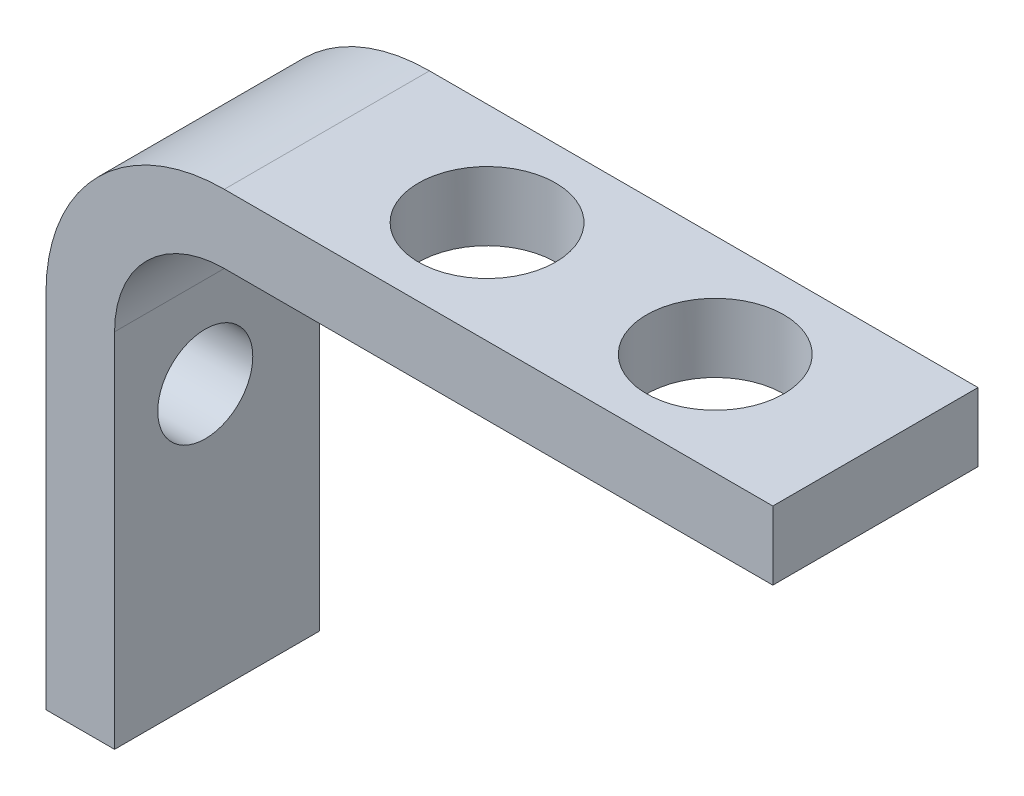
ISO-10303-21;
HEADER;
FILE_DESCRIPTION(('STEP AP214'),'2;1');
FILE_NAME('part.step','',(''),(''),'','','');
FILE_SCHEMA(('AUTOMOTIVE_DESIGN { 1 0 10303 214 1 1 1 1 }'));
ENDSEC;
DATA;
#1=APPLICATION_CONTEXT('core data for automotive mechanical design processes');
#2=APPLICATION_PROTOCOL_DEFINITION('international standard','automotive_design',2000,#1);
#3=PRODUCT_CONTEXT('',#1,'mechanical');
#4=PRODUCT('Part','Part','',(#3));
#5=PRODUCT_RELATED_PRODUCT_CATEGORY('part','',(#4));
#6=PRODUCT_DEFINITION_FORMATION('','',#4);
#7=PRODUCT_DEFINITION_CONTEXT('part definition',#1,'design');
#8=PRODUCT_DEFINITION('design','',#6,#7);
#9=PRODUCT_DEFINITION_SHAPE('','',#8);
#10=(LENGTH_UNIT() NAMED_UNIT(*) SI_UNIT(.MILLI.,.METRE.));
#11=(NAMED_UNIT(*) PLANE_ANGLE_UNIT() SI_UNIT($,.RADIAN.));
#12=(NAMED_UNIT(*) SI_UNIT($,.STERADIAN.) SOLID_ANGLE_UNIT());
#13=UNCERTAINTY_MEASURE_WITH_UNIT(LENGTH_MEASURE(1.E-05),#10,'distance_accuracy_value','');
#14=(GEOMETRIC_REPRESENTATION_CONTEXT(3) GLOBAL_UNCERTAINTY_ASSIGNED_CONTEXT((#13)) GLOBAL_UNIT_ASSIGNED_CONTEXT((#10,
#11,#12)) REPRESENTATION_CONTEXT('',''));
#15=CARTESIAN_POINT('',(0.,0.,0.));
#16=DIRECTION('',(0.,0.,1.));
#17=DIRECTION('',(1.,0.,0.));
#18=AXIS2_PLACEMENT_3D('',#15,#16,#17);
#19=CARTESIAN_POINT('',(-1.5875,0.,4.75));
#20=DIRECTION('',(0.,1.,0.));
#21=DIRECTION('',(0.,0.,1.));
#22=AXIS2_PLACEMENT_3D('',#19,#20,#21);
#23=PLANE('',#22);
#24=DIRECTION('',(1.,0.,0.));
#25=VECTOR('',#24,1.);
#26=CARTESIAN_POINT('',(-1.5875,0.,0.));
#27=LINE('',#26,#25);
#28=CARTESIAN_POINT('',(-1.5875,0.,0.));
#29=VERTEX_POINT('',#28);
#30=CARTESIAN_POINT('',(0.,0.,0.));
#31=VERTEX_POINT('',#30);
#32=EDGE_CURVE('E133',#29,#31,#27,.T.);
#33=ORIENTED_EDGE('',*,*,#32,.T.);
#34=DIRECTION('',(0.,0.,-1.));
#35=VECTOR('',#34,1.);
#36=CARTESIAN_POINT('',(0.,0.,4.75));
#37=LINE('',#36,#35);
#38=CARTESIAN_POINT('',(0.,0.,4.75));
#39=VERTEX_POINT('',#38);
#40=EDGE_CURVE('E11',#39,#31,#37,.T.);
#41=ORIENTED_EDGE('',*,*,#40,.F.);
#42=DIRECTION('',(1.,0.,0.));
#43=VECTOR('',#42,1.);
#44=CARTESIAN_POINT('',(-1.5875,0.,4.75));
#45=LINE('',#44,#43);
#46=CARTESIAN_POINT('',(-1.5875,0.,4.75));
#47=VERTEX_POINT('',#46);
#48=EDGE_CURVE('E148',#47,#39,#45,.T.);
#49=ORIENTED_EDGE('',*,*,#48,.F.);
#50=DIRECTION('',(0.,0.,-1.));
#51=VECTOR('',#50,1.);
#52=CARTESIAN_POINT('',(-1.5875,0.,4.75));
#53=LINE('',#52,#51);
#54=EDGE_CURVE('E129',#47,#29,#53,.T.);
#55=ORIENTED_EDGE('',*,*,#54,.T.);
#56=EDGE_LOOP('',(#33,#41,#49,#55));
#57=FACE_BOUND('',#56,.T.);
#58=ADVANCED_FACE('F35',(#57),#23,.F.);
#59=CARTESIAN_POINT('',(0.,0.,4.75));
#60=DIRECTION('',(-1.,0.,0.));
#61=DIRECTION('',(0.,0.,1.));
#62=AXIS2_PLACEMENT_3D('',#59,#60,#61);
#63=PLANE('',#62);
#64=CARTESIAN_POINT('',(0.,6.27699999999992,2.64999999999981));
#65=DIRECTION('',(-1.,0.,0.));
#66=DIRECTION('',(0.,0.,1.));
#67=AXIS2_PLACEMENT_3D('',#64,#65,#66);
#68=CIRCLE('',#67,1.1);
#69=CARTESIAN_POINT('',(0.,6.27699999999992,3.74999999999981));
#70=VERTEX_POINT('',#69);
#71=EDGE_CURVE('E137',#70,#70,#68,.T.);
#72=ORIENTED_EDGE('',*,*,#71,.T.);
#73=EDGE_LOOP('',(#72));
#74=FACE_BOUND('',#73,.T.);
#75=DIRECTION('',(0.,1.,0.));
#76=VECTOR('',#75,1.);
#77=CARTESIAN_POINT('',(0.,0.,0.));
#78=LINE('',#77,#76);
#79=CARTESIAN_POINT('',(0.,8.3725,0.));
#80=VERTEX_POINT('',#79);
#81=EDGE_CURVE('E136',#31,#80,#78,.T.);
#82=ORIENTED_EDGE('',*,*,#81,.T.);
#83=DIRECTION('',(0.,0.,-1.));
#84=VECTOR('',#83,1.);
#85=CARTESIAN_POINT('',(0.,8.3725,4.75));
#86=LINE('',#85,#84);
#87=CARTESIAN_POINT('',(0.,8.3725,4.75));
#88=VERTEX_POINT('',#87);
#89=EDGE_CURVE('E44',#88,#80,#86,.T.);
#90=ORIENTED_EDGE('',*,*,#89,.F.);
#91=DIRECTION('',(0.,1.,0.));
#92=VECTOR('',#91,1.);
#93=CARTESIAN_POINT('',(0.,0.,4.75));
#94=LINE('',#93,#92);
#95=EDGE_CURVE('E96',#39,#88,#94,.T.);
#96=ORIENTED_EDGE('',*,*,#95,.F.);
#97=ORIENTED_EDGE('',*,*,#40,.T.);
#98=EDGE_LOOP('',(#82,#90,#96,#97));
#99=FACE_BOUND('',#98,.T.);
#100=ADVANCED_FACE('F212',(#74,#99),#63,.F.);
#101=CARTESIAN_POINT('',(2.54,8.3725,4.75));
#102=DIRECTION('',(0.,0.,-1.));
#103=DIRECTION('',(-1.,0.,0.));
#104=AXIS2_PLACEMENT_3D('',#101,#102,#103);
#105=CYLINDRICAL_SURFACE('',#104,2.54);
#106=CARTESIAN_POINT('',(2.54,8.3725,0.));
#107=DIRECTION('',(0.,0.,-1.));
#108=DIRECTION('',(-1.,0.,0.));
#109=AXIS2_PLACEMENT_3D('',#106,#107,#108);
#110=CIRCLE('',#109,2.54);
#111=CARTESIAN_POINT('',(2.54,10.9125,0.));
#112=VERTEX_POINT('',#111);
#113=EDGE_CURVE('E139',#80,#112,#110,.T.);
#114=ORIENTED_EDGE('',*,*,#113,.T.);
#115=DIRECTION('',(0.,0.,-1.));
#116=VECTOR('',#115,1.);
#117=CARTESIAN_POINT('',(2.54,10.9125,4.75));
#118=LINE('',#117,#116);
#119=CARTESIAN_POINT('',(2.54,10.9125,4.75));
#120=VERTEX_POINT('',#119);
#121=EDGE_CURVE('E155',#120,#112,#118,.T.);
#122=ORIENTED_EDGE('',*,*,#121,.F.);
#123=CARTESIAN_POINT('',(2.54,8.3725,4.75));
#124=DIRECTION('',(0.,0.,-1.));
#125=DIRECTION('',(-1.,0.,0.));
#126=AXIS2_PLACEMENT_3D('',#123,#124,#125);
#127=CIRCLE('',#126,2.54);
#128=EDGE_CURVE('E180',#88,#120,#127,.T.);
#129=ORIENTED_EDGE('',*,*,#128,.F.);
#130=ORIENTED_EDGE('',*,*,#89,.T.);
#131=EDGE_LOOP('',(#114,#122,#129,#130));
#132=FACE_BOUND('',#131,.T.);
#133=ADVANCED_FACE('F216',(#132),#105,.F.);
#134=CARTESIAN_POINT('',(2.54,10.9125,4.75));
#135=DIRECTION('',(0.,1.,0.));
#136=DIRECTION('',(-1.,0.,0.));
#137=AXIS2_PLACEMENT_3D('',#134,#135,#136);
#138=PLANE('',#137);
#139=CARTESIAN_POINT('',(6.2484,10.9125,2.375));
#140=DIRECTION('',(0.,-1.,0.));
#141=DIRECTION('',(1.,0.,0.));
#142=AXIS2_PLACEMENT_3D('',#139,#140,#141);
#143=CIRCLE('',#142,1.5875);
#144=CARTESIAN_POINT('',(7.8359,10.9125,2.375));
#145=VERTEX_POINT('',#144);
#146=EDGE_CURVE('E161',#145,#145,#143,.T.);
#147=ORIENTED_EDGE('',*,*,#146,.F.);
#148=EDGE_LOOP('',(#147));
#149=FACE_BOUND('',#148,.T.);
#150=CARTESIAN_POINT('',(11.5316,10.9125,2.375));
#151=DIRECTION('',(0.,-1.,0.));
#152=DIRECTION('',(1.,0.,0.));
#153=AXIS2_PLACEMENT_3D('',#150,#151,#152);
#154=CIRCLE('',#153,1.5875);
#155=CARTESIAN_POINT('',(13.1191,10.9125,2.375));
#156=VERTEX_POINT('',#155);
#157=EDGE_CURVE('E167',#156,#156,#154,.T.);
#158=ORIENTED_EDGE('',*,*,#157,.F.);
#159=EDGE_LOOP('',(#158));
#160=FACE_BOUND('',#159,.T.);
#161=DIRECTION('',(1.,0.,0.));
#162=VECTOR('',#161,1.);
#163=CARTESIAN_POINT('',(2.54,10.9125,0.));
#164=LINE('',#163,#162);
#165=CARTESIAN_POINT('',(15.24,10.9125,0.));
#166=VERTEX_POINT('',#165);
#167=EDGE_CURVE('E141',#112,#166,#164,.T.);
#168=ORIENTED_EDGE('',*,*,#167,.T.);
#169=DIRECTION('',(0.,0.,-1.));
#170=VECTOR('',#169,1.);
#171=CARTESIAN_POINT('',(15.24,10.9125,4.75));
#172=LINE('',#171,#170);
#173=CARTESIAN_POINT('',(15.24,10.9125,4.75));
#174=VERTEX_POINT('',#173);
#175=EDGE_CURVE('E152',#174,#166,#172,.T.);
#176=ORIENTED_EDGE('',*,*,#175,.F.);
#177=DIRECTION('',(1.,0.,0.));
#178=VECTOR('',#177,1.);
#179=CARTESIAN_POINT('',(2.54,10.9125,4.75));
#180=LINE('',#179,#178);
#181=EDGE_CURVE('E182',#120,#174,#180,.T.);
#182=ORIENTED_EDGE('',*,*,#181,.F.);
#183=ORIENTED_EDGE('',*,*,#121,.T.);
#184=EDGE_LOOP('',(#168,#176,#182,#183));
#185=FACE_BOUND('',#184,.T.);
#186=ADVANCED_FACE('F188',(#149,#160,#185),#138,.F.);
#187=CARTESIAN_POINT('',(15.24,10.9125,4.75));
#188=DIRECTION('',(-1.,0.,0.));
#189=DIRECTION('',(0.,0.,1.));
#190=AXIS2_PLACEMENT_3D('',#187,#188,#189);
#191=PLANE('',#190);
#192=DIRECTION('',(0.,1.,0.));
#193=VECTOR('',#192,1.);
#194=CARTESIAN_POINT('',(15.24,10.9125,0.));
#195=LINE('',#194,#193);
#196=CARTESIAN_POINT('',(15.24,12.5,0.));
#197=VERTEX_POINT('',#196);
#198=EDGE_CURVE('E143',#166,#197,#195,.T.);
#199=ORIENTED_EDGE('',*,*,#198,.T.);
#200=DIRECTION('',(0.,0.,-1.));
#201=VECTOR('',#200,1.);
#202=CARTESIAN_POINT('',(15.24,12.5,4.75));
#203=LINE('',#202,#201);
#204=CARTESIAN_POINT('',(15.24,12.5,4.75));
#205=VERTEX_POINT('',#204);
#206=EDGE_CURVE('E124',#205,#197,#203,.T.);
#207=ORIENTED_EDGE('',*,*,#206,.F.);
#208=DIRECTION('',(0.,1.,0.));
#209=VECTOR('',#208,1.);
#210=CARTESIAN_POINT('',(15.24,10.9125,4.75));
#211=LINE('',#210,#209);
#212=EDGE_CURVE('E115',#174,#205,#211,.T.);
#213=ORIENTED_EDGE('',*,*,#212,.F.);
#214=ORIENTED_EDGE('',*,*,#175,.T.);
#215=EDGE_LOOP('',(#199,#207,#213,#214));
#216=FACE_BOUND('',#215,.T.);
#217=ADVANCED_FACE('F192',(#216),#191,.F.);
#218=CARTESIAN_POINT('',(2.54,12.5,4.75));
#219=DIRECTION('',(0.,-1.,0.));
#220=DIRECTION('',(0.,0.,-1.));
#221=AXIS2_PLACEMENT_3D('',#218,#219,#220);
#222=PLANE('',#221);
#223=CARTESIAN_POINT('',(6.2484,12.5,2.375));
#224=DIRECTION('',(0.,-1.,0.));
#225=DIRECTION('',(0.,0.,-1.));
#226=AXIS2_PLACEMENT_3D('',#223,#224,#225);
#227=CIRCLE('',#226,1.5875);
#228=CARTESIAN_POINT('',(6.2484,12.5,0.787499999999998));
#229=VERTEX_POINT('',#228);
#230=EDGE_CURVE('E38',#229,#229,#227,.T.);
#231=ORIENTED_EDGE('',*,*,#230,.T.);
#232=EDGE_LOOP('',(#231));
#233=FACE_BOUND('',#232,.T.);
#234=CARTESIAN_POINT('',(11.5316,12.5,2.375));
#235=DIRECTION('',(0.,-1.,0.));
#236=DIRECTION('',(0.,0.,-1.));
#237=AXIS2_PLACEMENT_3D('',#234,#235,#236);
#238=CIRCLE('',#237,1.5875);
#239=CARTESIAN_POINT('',(11.5316,12.5,0.787499999999999));
#240=VERTEX_POINT('',#239);
#241=EDGE_CURVE('E159',#240,#240,#238,.T.);
#242=ORIENTED_EDGE('',*,*,#241,.T.);
#243=EDGE_LOOP('',(#242));
#244=FACE_BOUND('',#243,.T.);
#245=DIRECTION('',(-1.,0.,0.));
#246=VECTOR('',#245,1.);
#247=CARTESIAN_POINT('',(2.54,12.5,0.));
#248=LINE('',#247,#246);
#249=CARTESIAN_POINT('',(2.54,12.5,0.));
#250=VERTEX_POINT('',#249);
#251=EDGE_CURVE('E123',#197,#250,#248,.T.);
#252=ORIENTED_EDGE('',*,*,#251,.T.);
#253=DIRECTION('',(0.,0.,-1.));
#254=VECTOR('',#253,1.);
#255=CARTESIAN_POINT('',(2.54,12.5,4.75));
#256=LINE('',#255,#254);
#257=CARTESIAN_POINT('',(2.54,12.5,4.75));
#258=VERTEX_POINT('',#257);
#259=EDGE_CURVE('E120',#258,#250,#256,.T.);
#260=ORIENTED_EDGE('',*,*,#259,.F.);
#261=DIRECTION('',(-1.,0.,0.));
#262=VECTOR('',#261,1.);
#263=CARTESIAN_POINT('',(2.54,12.5,4.75));
#264=LINE('',#263,#262);
#265=EDGE_CURVE('E109',#205,#258,#264,.T.);
#266=ORIENTED_EDGE('',*,*,#265,.F.);
#267=ORIENTED_EDGE('',*,*,#206,.T.);
#268=EDGE_LOOP('',(#252,#260,#266,#267));
#269=FACE_BOUND('',#268,.T.);
#270=ADVANCED_FACE('F121',(#233,#244,#269),#222,.F.);
#271=CARTESIAN_POINT('',(2.54,8.3725,4.75));
#272=DIRECTION('',(0.,0.,-1.));
#273=DIRECTION('',(-1.,0.,0.));
#274=AXIS2_PLACEMENT_3D('',#271,#272,#273);
#275=CYLINDRICAL_SURFACE('',#274,4.1275);
#276=CARTESIAN_POINT('',(2.54,8.3725,0.));
#277=DIRECTION('',(0.,0.,1.));
#278=DIRECTION('',(-1.,0.,0.));
#279=AXIS2_PLACEMENT_3D('',#276,#277,#278);
#280=CIRCLE('',#279,4.1275);
#281=CARTESIAN_POINT('',(-1.5875,8.3725,0.));
#282=VERTEX_POINT('',#281);
#283=EDGE_CURVE('E82',#250,#282,#280,.T.);
#284=ORIENTED_EDGE('',*,*,#283,.T.);
#285=DIRECTION('',(0.,0.,-1.));
#286=VECTOR('',#285,1.);
#287=CARTESIAN_POINT('',(-1.5875,8.3725,4.75));
#288=LINE('',#287,#286);
#289=CARTESIAN_POINT('',(-1.5875,8.3725,4.75));
#290=VERTEX_POINT('',#289);
#291=EDGE_CURVE('E125',#290,#282,#288,.T.);
#292=ORIENTED_EDGE('',*,*,#291,.F.);
#293=CARTESIAN_POINT('',(2.54,8.3725,4.75));
#294=DIRECTION('',(0.,0.,1.));
#295=DIRECTION('',(-1.,0.,0.));
#296=AXIS2_PLACEMENT_3D('',#293,#294,#295);
#297=CIRCLE('',#296,4.1275);
#298=EDGE_CURVE('E113',#258,#290,#297,.T.);
#299=ORIENTED_EDGE('',*,*,#298,.F.);
#300=ORIENTED_EDGE('',*,*,#259,.T.);
#301=EDGE_LOOP('',(#284,#292,#299,#300));
#302=FACE_BOUND('',#301,.T.);
#303=ADVANCED_FACE('F127',(#302),#275,.T.);
#304=CARTESIAN_POINT('',(-1.5875,0.,4.75));
#305=DIRECTION('',(1.,0.,0.));
#306=DIRECTION('',(0.,0.,-1.));
#307=AXIS2_PLACEMENT_3D('',#304,#305,#306);
#308=PLANE('',#307);
#309=CARTESIAN_POINT('',(-1.5875,6.27699999999992,2.64999999999981));
#310=DIRECTION('',(1.,0.,0.));
#311=DIRECTION('',(0.,0.,-1.));
#312=AXIS2_PLACEMENT_3D('',#309,#310,#311);
#313=CIRCLE('',#312,1.1);
#314=CARTESIAN_POINT('',(-1.5875,6.27699999999992,1.54999999999981));
#315=VERTEX_POINT('',#314);
#316=EDGE_CURVE('E165',#315,#315,#313,.T.);
#317=ORIENTED_EDGE('',*,*,#316,.T.);
#318=EDGE_LOOP('',(#317));
#319=FACE_BOUND('',#318,.T.);
#320=DIRECTION('',(0.,-1.,0.));
#321=VECTOR('',#320,1.);
#322=CARTESIAN_POINT('',(-1.5875,0.,0.));
#323=LINE('',#322,#321);
#324=EDGE_CURVE('E88',#282,#29,#323,.T.);
#325=ORIENTED_EDGE('',*,*,#324,.T.);
#326=ORIENTED_EDGE('',*,*,#54,.F.);
#327=DIRECTION('',(0.,-1.,0.));
#328=VECTOR('',#327,1.);
#329=CARTESIAN_POINT('',(-1.5875,0.,4.75));
#330=LINE('',#329,#328);
#331=EDGE_CURVE('E53',#290,#47,#330,.T.);
#332=ORIENTED_EDGE('',*,*,#331,.F.);
#333=ORIENTED_EDGE('',*,*,#291,.T.);
#334=EDGE_LOOP('',(#325,#326,#332,#333));
#335=FACE_BOUND('',#334,.T.);
#336=ADVANCED_FACE('F200',(#319,#335),#308,.F.);
#337=CARTESIAN_POINT('',(2.54,8.3725,4.75));
#338=DIRECTION('',(0.,0.,-1.));
#339=DIRECTION('',(-1.,0.,0.));
#340=AXIS2_PLACEMENT_3D('',#337,#338,#339);
#341=PLANE('',#340);
#342=ORIENTED_EDGE('',*,*,#48,.T.);
#343=ORIENTED_EDGE('',*,*,#95,.T.);
#344=ORIENTED_EDGE('',*,*,#128,.T.);
#345=ORIENTED_EDGE('',*,*,#181,.T.);
#346=ORIENTED_EDGE('',*,*,#212,.T.);
#347=ORIENTED_EDGE('',*,*,#265,.T.);
#348=ORIENTED_EDGE('',*,*,#298,.T.);
#349=ORIENTED_EDGE('',*,*,#331,.T.);
#350=EDGE_LOOP('',(#342,#343,#344,#345,#346,#347,#348,#349));
#351=FACE_BOUND('',#350,.T.);
#352=ADVANCED_FACE('F111',(#351),#341,.F.);
#353=CARTESIAN_POINT('',(2.54,8.3725,0.));
#354=DIRECTION('',(0.,0.,-1.));
#355=DIRECTION('',(-1.,0.,0.));
#356=AXIS2_PLACEMENT_3D('',#353,#354,#355);
#357=PLANE('',#356);
#358=ORIENTED_EDGE('',*,*,#32,.F.);
#359=ORIENTED_EDGE('',*,*,#324,.F.);
#360=ORIENTED_EDGE('',*,*,#283,.F.);
#361=ORIENTED_EDGE('',*,*,#251,.F.);
#362=ORIENTED_EDGE('',*,*,#198,.F.);
#363=ORIENTED_EDGE('',*,*,#167,.F.);
#364=ORIENTED_EDGE('',*,*,#113,.F.);
#365=ORIENTED_EDGE('',*,*,#81,.F.);
#366=EDGE_LOOP('',(#358,#359,#360,#361,#362,#363,#364,#365));
#367=FACE_BOUND('',#366,.T.);
#368=ADVANCED_FACE('F195',(#367),#357,.T.);
#369=CARTESIAN_POINT('',(-1.5885,6.27699999999992,2.64999999999981));
#370=DIRECTION('',(1.,0.,0.));
#371=DIRECTION('',(0.,0.,-1.));
#372=AXIS2_PLACEMENT_3D('',#369,#370,#371);
#373=CYLINDRICAL_SURFACE('',#372,1.1);
#374=ORIENTED_EDGE('',*,*,#71,.F.);
#375=EDGE_LOOP('',(#374));
#376=FACE_BOUND('',#375,.T.);
#377=ORIENTED_EDGE('',*,*,#316,.F.);
#378=EDGE_LOOP('',(#377));
#379=FACE_BOUND('',#378,.T.);
#380=ADVANCED_FACE('F242',(#376,#379),#373,.F.);
#381=CARTESIAN_POINT('',(11.5316,13.4525,2.375));
#382=DIRECTION('',(0.,-1.,0.));
#383=DIRECTION('',(1.,0.,0.));
#384=AXIS2_PLACEMENT_3D('',#381,#382,#383);
#385=CYLINDRICAL_SURFACE('',#384,1.5875);
#386=ORIENTED_EDGE('',*,*,#157,.T.);
#387=EDGE_LOOP('',(#386));
#388=FACE_BOUND('',#387,.T.);
#389=ORIENTED_EDGE('',*,*,#241,.F.);
#390=EDGE_LOOP('',(#389));
#391=FACE_BOUND('',#390,.T.);
#392=ADVANCED_FACE('F237',(#388,#391),#385,.F.);
#393=CARTESIAN_POINT('',(6.2484,13.4525,2.375));
#394=DIRECTION('',(0.,-1.,0.));
#395=DIRECTION('',(1.,0.,0.));
#396=AXIS2_PLACEMENT_3D('',#393,#394,#395);
#397=CYLINDRICAL_SURFACE('',#396,1.5875);
#398=ORIENTED_EDGE('',*,*,#146,.T.);
#399=EDGE_LOOP('',(#398));
#400=FACE_BOUND('',#399,.T.);
#401=ORIENTED_EDGE('',*,*,#230,.F.);
#402=EDGE_LOOP('',(#401));
#403=FACE_BOUND('',#402,.T.);
#404=ADVANCED_FACE('F235',(#400,#403),#397,.F.);
#405=CLOSED_SHELL('',(#58,#100,#133,#186,#217,#270,#303,#336,#352,#368,#380,#392,#404));
#406=MANIFOLD_SOLID_BREP('B2',#405);
#407=ADVANCED_BREP_SHAPE_REPRESENTATION('',(#18,#406),#14);
#408=SHAPE_DEFINITION_REPRESENTATION(#9,#407);
ENDSEC;
END-ISO-10303-21;
